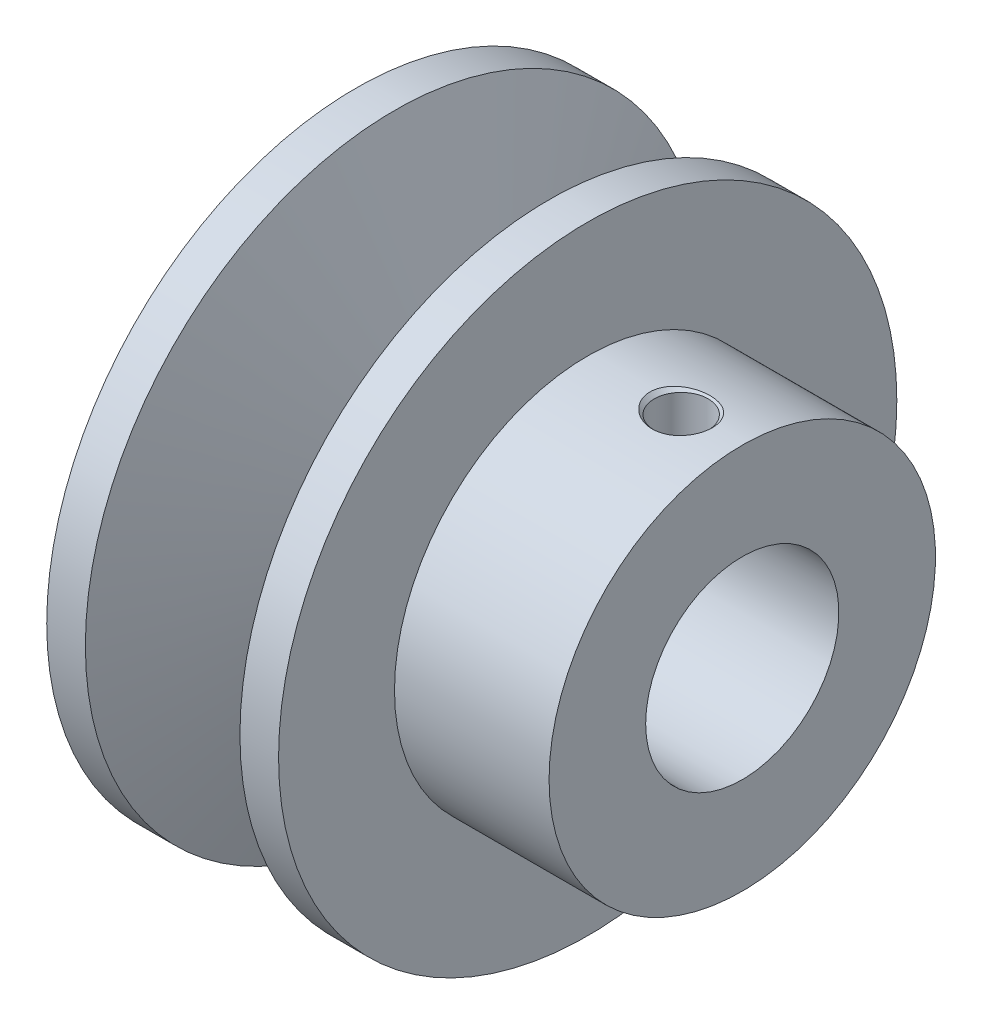
ISO-10303-21;
HEADER;
FILE_DESCRIPTION(('STEP AP214'),'2;1');
FILE_NAME('part.step','',(''),(''),'','','');
FILE_SCHEMA(('AUTOMOTIVE_DESIGN { 1 0 10303 214 1 1 1 1 }'));
ENDSEC;
DATA;
#1=APPLICATION_CONTEXT('core data for automotive mechanical design processes');
#2=APPLICATION_PROTOCOL_DEFINITION('international standard','automotive_design',2000,#1);
#3=PRODUCT_CONTEXT('',#1,'mechanical');
#4=PRODUCT('Part','Part','',(#3));
#5=PRODUCT_RELATED_PRODUCT_CATEGORY('part','',(#4));
#6=PRODUCT_DEFINITION_FORMATION('','',#4);
#7=PRODUCT_DEFINITION_CONTEXT('part definition',#1,'design');
#8=PRODUCT_DEFINITION('design','',#6,#7);
#9=PRODUCT_DEFINITION_SHAPE('','',#8);
#10=(LENGTH_UNIT() NAMED_UNIT(*) SI_UNIT(.MILLI.,.METRE.));
#11=(NAMED_UNIT(*) PLANE_ANGLE_UNIT() SI_UNIT($,.RADIAN.));
#12=(NAMED_UNIT(*) SI_UNIT($,.STERADIAN.) SOLID_ANGLE_UNIT());
#13=UNCERTAINTY_MEASURE_WITH_UNIT(LENGTH_MEASURE(1.E-05),#10,'distance_accuracy_value','');
#14=(GEOMETRIC_REPRESENTATION_CONTEXT(3) GLOBAL_UNCERTAINTY_ASSIGNED_CONTEXT((#13)) GLOBAL_UNIT_ASSIGNED_CONTEXT((#10,
#11,#12)) REPRESENTATION_CONTEXT('',''));
#15=CARTESIAN_POINT('',(0.,0.,0.));
#16=DIRECTION('',(0.,0.,1.));
#17=DIRECTION('',(1.,0.,0.));
#18=AXIS2_PLACEMENT_3D('',#15,#16,#17);
#19=CARTESIAN_POINT('',(0.,0.,0.));
#20=DIRECTION('',(-1.,0.,0.));
#21=DIRECTION('',(0.,0.,1.));
#22=AXIS2_PLACEMENT_3D('',#19,#20,#21);
#23=PLANE('',#22);
#24=CARTESIAN_POINT('',(0.,0.,0.));
#25=DIRECTION('',(-1.,0.,0.));
#26=DIRECTION('',(0.,0.,1.));
#27=AXIS2_PLACEMENT_3D('',#24,#25,#26);
#28=CIRCLE('',#27,40.);
#29=CARTESIAN_POINT('',(0.,0.,40.));
#30=VERTEX_POINT('',#29);
#31=EDGE_CURVE('E118',#30,#30,#28,.T.);
#32=ORIENTED_EDGE('',*,*,#31,.T.);
#33=EDGE_LOOP('',(#32));
#34=FACE_BOUND('',#33,.T.);
#35=CARTESIAN_POINT('',(0.,0.,0.));
#36=DIRECTION('',(-1.,0.,0.));
#37=DIRECTION('',(0.,0.,1.));
#38=AXIS2_PLACEMENT_3D('',#35,#36,#37);
#39=CIRCLE('',#38,20.);
#40=CARTESIAN_POINT('',(0.,0.,20.));
#41=VERTEX_POINT('',#40);
#42=EDGE_CURVE('E51',#41,#41,#39,.T.);
#43=ORIENTED_EDGE('',*,*,#42,.F.);
#44=EDGE_LOOP('',(#43));
#45=FACE_BOUND('',#44,.T.);
#46=ADVANCED_FACE('F39',(#34,#45),#23,.T.);
#47=CARTESIAN_POINT('',(5.,0.,0.));
#48=DIRECTION('',(-1.,0.,0.));
#49=DIRECTION('',(0.,0.,1.));
#50=AXIS2_PLACEMENT_3D('',#47,#48,#49);
#51=CONICAL_SURFACE('',#50,12.5,0.982793723247329);
#52=ORIENTED_EDGE('',*,*,#42,.T.);
#53=EDGE_LOOP('',(#52));
#54=FACE_BOUND('',#53,.T.);
#55=CARTESIAN_POINT('',(5.,0.,0.));
#56=DIRECTION('',(-1.,0.,0.));
#57=DIRECTION('',(0.,0.,1.));
#58=AXIS2_PLACEMENT_3D('',#55,#56,#57);
#59=CIRCLE('',#58,12.5);
#60=CARTESIAN_POINT('',(5.,0.,12.5));
#61=VERTEX_POINT('',#60);
#62=EDGE_CURVE('E54',#61,#61,#59,.T.);
#63=ORIENTED_EDGE('',*,*,#62,.F.);
#64=EDGE_LOOP('',(#63));
#65=FACE_BOUND('',#64,.T.);
#66=ADVANCED_FACE('F106',(#54,#65),#51,.F.);
#67=CARTESIAN_POINT('',(0.,0.,0.));
#68=DIRECTION('',(-1.,0.,0.));
#69=DIRECTION('',(0.,0.,1.));
#70=AXIS2_PLACEMENT_3D('',#67,#68,#69);
#71=CYLINDRICAL_SURFACE('',#70,12.5);
#72=CARTESIAN_POINT('',(42.0953049806795,12.,3.49999999999986));
#73=CARTESIAN_POINT('',(42.2877198053964,12.0000029182384,3.49999615237451));
#74=CARTESIAN_POINT('',(42.4801740218123,12.0046785544293,3.48407876334702));
#75=CARTESIAN_POINT('',(42.8594978347618,12.0228128498504,3.42096698504646));
#76=CARTESIAN_POINT('',(43.0463649620359,12.0362753342026,3.37375897408926));
#77=CARTESIAN_POINT('',(43.4089712475403,12.0703417038929,3.24976086719803));
#78=CARTESIAN_POINT('',(43.5847266870343,12.090934840205,3.17301527806601));
#79=CARTESIAN_POINT('',(43.9209015205686,12.1369281684911,2.99226282033324));
#80=CARTESIAN_POINT('',(44.0813192809724,12.1623288716688,2.88825305219327));
#81=CARTESIAN_POINT('',(44.3866874404064,12.2158603074866,2.65285688670764));
#82=CARTESIAN_POINT('',(44.5311523905499,12.2440433222756,2.52085249343839));
#83=CARTESIAN_POINT('',(44.7962102340267,12.2995144458837,2.23454150476446));
#84=CARTESIAN_POINT('',(44.9168004331992,12.3268024534157,2.08023239576599));
#85=CARTESIAN_POINT('',(45.1327422279712,12.3779964293708,1.75029227363621));
#86=CARTESIAN_POINT('',(45.2276064216959,12.4018335593886,1.57433065035361));
#87=CARTESIAN_POINT('',(45.3862164943987,12.4428371907732,1.20817457795212));
#88=CARTESIAN_POINT('',(45.4499681815116,12.4600049370697,1.01798279299525));
#89=CARTESIAN_POINT('',(45.5429587727763,12.4853656892475,0.633837060621582));
#90=CARTESIAN_POINT('',(45.5730245817056,12.4937733520519,0.440097705604466));
#91=CARTESIAN_POINT('',(45.6003966119025,12.5014192399288,0.0501545766812189));
#92=CARTESIAN_POINT('',(45.5977088560936,12.5006591508232,-0.146048737508597));
#93=CARTESIAN_POINT('',(45.5602218418133,12.4902103188576,-0.529577185864506));
#94=CARTESIAN_POINT('',(45.5263167479014,12.4807702097015,-0.71699753814516));
#95=CARTESIAN_POINT('',(45.4288082484994,12.4543187948504,-1.08337362960891));
#96=CARTESIAN_POINT('',(45.3652030682884,12.4373070367162,-1.26232886225715));
#97=CARTESIAN_POINT('',(45.2094459914205,12.3972647344828,-1.60891633543925));
#98=CARTESIAN_POINT('',(45.116997565171,12.3741720778,-1.77640784364442));
#99=CARTESIAN_POINT('',(44.906408380783,12.3244414260412,-2.09379770763238));
#100=CARTESIAN_POINT('',(44.7882621794386,12.2978026803105,-2.24369232573512));
#101=CARTESIAN_POINT('',(44.5249257414259,12.2427920342732,-2.5269717598349));
#102=CARTESIAN_POINT('',(44.3789573405153,12.2143919832094,-2.65962862514612));
#103=CARTESIAN_POINT('',(44.0665571699179,12.1598610870605,-2.89876928059107));
#104=CARTESIAN_POINT('',(43.9001238747507,12.1337304113856,-3.00525111782691));
#105=CARTESIAN_POINT('',(43.5498105307102,12.0865750163485,-3.18965050384769));
#106=CARTESIAN_POINT('',(43.3658104712445,12.0655895187615,-3.26735080873382));
#107=CARTESIAN_POINT('',(42.9866207261445,12.0315777632379,-3.39046632280543));
#108=CARTESIAN_POINT('',(42.7914341629893,12.0185492959839,-3.43589049422677));
#109=CARTESIAN_POINT('',(42.4022672240517,12.0024030241428,-3.49186889507224));
#110=CARTESIAN_POINT('',(42.2084569351402,11.9989744317496,-3.50351705492399));
#111=CARTESIAN_POINT('',(41.8216538489836,12.0015622285672,-3.49464270434583));
#112=CARTESIAN_POINT('',(41.6286609571839,12.0075774936582,-3.47412402279482));
#113=CARTESIAN_POINT('',(41.2533181274093,12.0280731128579,-3.40246685788961));
#114=CARTESIAN_POINT('',(41.0708280182838,12.04236656542,-3.35200384613678));
#115=CARTESIAN_POINT('',(40.7169070485366,12.0776211582941,-3.22265905357556));
#116=CARTESIAN_POINT('',(40.5454777424725,12.0985832334134,-3.14377328826126));
#117=CARTESIAN_POINT('',(40.2140171513165,12.1454373448375,-2.95765848560508));
#118=CARTESIAN_POINT('',(40.0543563706678,12.1714352674676,-2.84979689170079));
#119=CARTESIAN_POINT('',(39.7549997366154,12.2251912476975,-2.60956338877981));
#120=CARTESIAN_POINT('',(39.6153080451295,12.252949670482,-2.47718638346852));
#121=CARTESIAN_POINT('',(39.3552202530565,12.3081829234521,-2.18658730527825));
#122=CARTESIAN_POINT('',(39.2355920315174,12.335619714701,-2.02766922094423));
#123=CARTESIAN_POINT('',(39.0247000545139,12.3862060696637,-1.6913803752073));
#124=CARTESIAN_POINT('',(38.93343480047,12.4093558598584,-1.51401058937555));
#125=CARTESIAN_POINT('',(38.7827229221558,12.4486113106072,-1.14709270155216));
#126=CARTESIAN_POINT('',(38.7230356533498,12.4647700697764,-0.957649404950056));
#127=CARTESIAN_POINT('',(38.6365019997775,12.4884571543435,-0.570896024719972));
#128=CARTESIAN_POINT('',(38.6096475289984,12.4959876046799,-0.373587890398067));
#129=CARTESIAN_POINT('',(38.5900909894795,12.5014579192325,0.0161518687343968));
#130=CARTESIAN_POINT('',(38.5962678072704,12.4997126237562,0.208523574951511));
#131=CARTESIAN_POINT('',(38.639965628371,12.4875511892793,0.58937813506102));
#132=CARTESIAN_POINT('',(38.6774852330874,12.4771354371761,0.777861162091423));
#133=CARTESIAN_POINT('',(38.7821447480403,12.4488768980248,1.14409378229163));
#134=CARTESIAN_POINT('',(38.8490367234837,12.4310963476457,1.32191935297344));
#135=CARTESIAN_POINT('',(39.0103216686803,12.3899581514136,1.66392283506992));
#136=CARTESIAN_POINT('',(39.1047187816056,12.3665996654369,1.82809868559859));
#137=CARTESIAN_POINT('',(39.3214999777242,12.3159487927087,2.14327684605579));
#138=CARTESIAN_POINT('',(39.4446122357521,12.2885624327911,2.29376313547123));
#139=CARTESIAN_POINT('',(39.7139752781246,12.2332900651242,2.57231846002981));
#140=CARTESIAN_POINT('',(39.8602323554171,12.205403923321,2.7003813783769));
#141=CARTESIAN_POINT('',(40.1761168511118,12.1514815437646,2.93363501349719));
#142=CARTESIAN_POINT('',(40.3462360260642,12.1255087622321,3.03817587370681));
#143=CARTESIAN_POINT('',(40.7023416325963,12.0792917300542,3.21703260079236));
#144=CARTESIAN_POINT('',(40.8883186358859,12.059044105996,3.29136627786814));
#145=CARTESIAN_POINT('',(41.2436097301239,12.0290742856874,3.39912168142623));
#146=CARTESIAN_POINT('',(41.4115353788088,12.0182651534564,3.43685652188085));
#147=CARTESIAN_POINT('',(41.7513989091479,12.0037272136938,3.48729560764374));
#148=CARTESIAN_POINT('',(41.9233362124471,11.9999973918545,3.5000034387754));
#149=CARTESIAN_POINT('',(42.0953049806795,12.,3.49999999999986));
#150=B_SPLINE_CURVE_WITH_KNOTS('',3,(#72,#73,#74,#75,#76,#77,#78,#79,#80,#81,#82,#83,#84,#85,
#86,#87,#88,#89,#90,#91,#92,#93,#94,#95,#96,#97,#98,#99,#100,#101,#102,#103,#104,#105,#106,#107,
#108,#109,#110,#111,#112,#113,#114,#115,#116,#117,#118,#119,#120,#121,#122,#123,#124,#125,#126,
#127,#128,#129,#130,#131,#132,#133,#134,#135,#136,#137,#138,#139,#140,#141,#142,#143,#144,#145,
#146,#147,#148,#149),.UNSPECIFIED.,.T.,.F.,(4,2,2,2,2,2,2,2,2,2,2,2,2,2,2,2,2,2,2,2,2,2,2,2,2,2,
2,2,2,2,2,2,2,2,2,2,2,2,4),(0.,0.576611367799125,1.15347391568279,1.72947063688369,
2.30552864007482,2.89595138133577,3.48644071128029,4.08743969019362,4.68832643065513,
5.27411559708616,5.85979704669184,6.4292076701932,6.99865232303127,7.5741557255573,
8.14978114796733,8.74483404784928,9.33993133068579,9.93943306827212,10.5387682748256,
11.1184628491913,11.6980884266741,12.2651111154848,12.8322133245598,13.4128741853846,
13.9936558904935,14.5931741279637,15.1926606840337,15.7875104510376,16.3822136897969,
16.9568630014037,17.5314866720957,18.1013504374818,18.6713000873781,19.2576755819283,
19.8442107835224,20.4453695275071,21.046173311345,21.5615876367407,22.0769281091554),.UNSPECIFIED.);
#151=CARTESIAN_POINT('',(42.0953049806795,12.,3.49999999999986));
#152=VERTEX_POINT('',#151);
#153=EDGE_CURVE('E45',#152,#152,#150,.T.);
#154=ORIENTED_EDGE('',*,*,#153,.T.);
#155=EDGE_LOOP('',(#154));
#156=FACE_BOUND('',#155,.T.);
#157=CARTESIAN_POINT('',(50.,0.,0.));
#158=DIRECTION('',(-1.,0.,0.));
#159=DIRECTION('',(0.,0.,1.));
#160=AXIS2_PLACEMENT_3D('',#157,#158,#159);
#161=CIRCLE('',#160,12.5);
#162=CARTESIAN_POINT('',(50.,0.,12.5));
#163=VERTEX_POINT('',#162);
#164=EDGE_CURVE('E125',#163,#163,#161,.T.);
#165=ORIENTED_EDGE('',*,*,#164,.F.);
#166=EDGE_LOOP('',(#165));
#167=FACE_BOUND('',#166,.T.);
#168=ORIENTED_EDGE('',*,*,#62,.T.);
#169=EDGE_LOOP('',(#168));
#170=FACE_BOUND('',#169,.T.);
#171=ADVANCED_FACE('F112',(#156,#167,#170),#71,.F.);
#172=CARTESIAN_POINT('',(50.,0.,0.));
#173=DIRECTION('',(-1.,0.,0.));
#174=DIRECTION('',(0.,0.,1.));
#175=AXIS2_PLACEMENT_3D('',#172,#173,#174);
#176=PLANE('',#175);
#177=CARTESIAN_POINT('',(50.,0.,0.));
#178=DIRECTION('',(-1.,0.,0.));
#179=DIRECTION('',(0.,0.,1.));
#180=AXIS2_PLACEMENT_3D('',#177,#178,#179);
#181=CIRCLE('',#180,25.);
#182=CARTESIAN_POINT('',(50.,0.,25.));
#183=VERTEX_POINT('',#182);
#184=EDGE_CURVE('E121',#183,#183,#181,.T.);
#185=ORIENTED_EDGE('',*,*,#184,.F.);
#186=EDGE_LOOP('',(#185));
#187=FACE_BOUND('',#186,.T.);
#188=ORIENTED_EDGE('',*,*,#164,.T.);
#189=EDGE_LOOP('',(#188));
#190=FACE_BOUND('',#189,.T.);
#191=ADVANCED_FACE('F101',(#187,#190),#176,.F.);
#192=CARTESIAN_POINT('',(0.,0.,0.));
#193=DIRECTION('',(-1.,0.,0.));
#194=DIRECTION('',(0.,0.,1.));
#195=AXIS2_PLACEMENT_3D('',#192,#193,#194);
#196=CYLINDRICAL_SURFACE('',#195,25.);
#197=CARTESIAN_POINT('',(39.3388749347931,24.8510405488022,-2.72502912292255));
#198=CARTESIAN_POINT('',(39.1947437964581,24.8648694537165,-2.59890878351794));
#199=CARTESIAN_POINT('',(39.0598347945445,24.8788828021447,-2.46225876568921));
#200=CARTESIAN_POINT('',(38.8119625183708,24.906064640308,-2.17012810773962));
#201=CARTESIAN_POINT('',(38.6990063583503,24.9192328552385,-2.01464138963648));
#202=CARTESIAN_POINT('',(38.4861654434584,24.9449931089477,-1.66766142687128));
#203=CARTESIAN_POINT('',(38.3895976993282,24.9573150267982,-1.47409175525755));
#204=CARTESIAN_POINT('',(38.232862734936,24.9777923395279,-1.07248484754528));
#205=CARTESIAN_POINT('',(38.1726902944377,24.9859483319063,-0.864449691029086));
#206=CARTESIAN_POINT('',(38.0944769916039,24.9966341722983,-0.455267654947966));
#207=CARTESIAN_POINT('',(38.0738305077609,24.9995114010291,-0.254626327452572));
#208=CARTESIAN_POINT('',(38.0676121462325,25.000373132344,0.147170878813862));
#209=CARTESIAN_POINT('',(38.0820291960299,24.9983591794873,0.348326575116012));
#210=CARTESIAN_POINT('',(38.1440769689478,24.9898452836992,0.737704342598313));
#211=CARTESIAN_POINT('',(38.1904676005086,24.9835129232976,0.926130050192603));
#212=CARTESIAN_POINT('',(38.3132414251494,24.9672286203511,1.29274787669188));
#213=CARTESIAN_POINT('',(38.3896272347885,24.9572763620384,1.47093910126086));
#214=CARTESIAN_POINT('',(38.5718455798877,24.9344936058842,1.81711657439037));
#215=CARTESIAN_POINT('',(38.6783728592816,24.9215967855879,1.9847316031745));
#216=CARTESIAN_POINT('',(38.9163534042796,24.8943847491826,2.30105697819928));
#217=CARTESIAN_POINT('',(39.0478133722965,24.8800691521729,2.44976222310894));
#218=CARTESIAN_POINT('',(39.3413046711416,24.8504170764117,2.73471753905172));
#219=CARTESIAN_POINT('',(39.5047947821154,24.8350765044807,2.86946401827029));
#220=CARTESIAN_POINT('',(39.8509353597593,24.8058860023052,3.1117433374479));
#221=CARTESIAN_POINT('',(40.0335918659168,24.7920365447249,3.2192675628079));
#222=CARTESIAN_POINT('',(40.4265641193753,24.7663054029568,3.41178006766437));
#223=CARTESIAN_POINT('',(40.637920365646,24.7546281750934,3.49467503100745));
#224=CARTESIAN_POINT('',(41.0713285038409,24.7357703219025,3.62575028196062));
#225=CARTESIAN_POINT('',(41.2933828555223,24.7285907360583,3.67392254493768));
#226=CARTESIAN_POINT('',(41.7521906109357,24.7192890722535,3.73601588211088));
#227=CARTESIAN_POINT('',(41.9891636390764,24.717400089943,3.74835920094643));
#228=CARTESIAN_POINT('',(42.4619228610284,24.7195622288109,3.73407066772567));
#229=CARTESIAN_POINT('',(42.6977089010381,24.7236141008461,3.70743388902703));
#230=CARTESIAN_POINT('',(43.1644072571417,24.737283064781,3.61511018186581));
#231=CARTESIAN_POINT('',(43.3952232865457,24.7469683373384,3.5489445677029));
#232=CARTESIAN_POINT('',(43.8421118076505,24.7708178271256,3.3784541790161));
#233=CARTESIAN_POINT('',(44.0581838853785,24.7849821700534,3.2741283335723));
#234=CARTESIAN_POINT('',(44.4653621210813,24.815819789819,3.03146050823784));
#235=CARTESIAN_POINT('',(44.6568180991224,24.8324483606611,2.89370130225038));
#236=CARTESIAN_POINT('',(45.0121941033945,24.8663365671842,2.58633307372736));
#237=CARTESIAN_POINT('',(45.1761215249802,24.8835960318577,2.41673263113196));
#238=CARTESIAN_POINT('',(45.4622359470931,24.9156311819385,2.05954555718347));
#239=CARTESIAN_POINT('',(45.5861502049298,24.9304893546981,1.87335282911859));
#240=CARTESIAN_POINT('',(45.7980361725541,24.9568461769423,1.48130866893327));
#241=CARTESIAN_POINT('',(45.8860292972401,24.968346826894,1.27546904017611));
#242=CARTESIAN_POINT('',(46.0165963042827,24.9857310709894,0.867044732083355));
#243=CARTESIAN_POINT('',(46.0621378797945,24.9919780403724,0.665422831222874));
#244=CARTESIAN_POINT('',(46.1168518091061,24.9995083139794,0.257232113938802));
#245=CARTESIAN_POINT('',(46.1260383333262,25.0007935521753,0.0506652565448771));
#246=CARTESIAN_POINT('',(46.108141069363,24.9983150038393,-0.349435595093549));
#247=CARTESIAN_POINT('',(46.0830203857678,24.9948244727884,-0.54306262130277));
#248=CARTESIAN_POINT('',(46.0010307492667,24.9836681062702,-0.923320524407542));
#249=CARTESIAN_POINT('',(45.9441623048949,24.9760023376818,-1.10995151331419));
#250=CARTESIAN_POINT('',(45.8006086041687,24.9572788429522,-1.47218553999287));
#251=CARTESIAN_POINT('',(45.7137797384204,24.9462048080967,-1.64773055494787));
#252=CARTESIAN_POINT('',(45.5135152057304,24.9218193116637,-1.98271988861429));
#253=CARTESIAN_POINT('',(45.4000736952815,24.9085073588745,-2.14216066019968));
#254=CARTESIAN_POINT('',(45.1430158448994,24.8801413336931,-2.45028303377477));
#255=CARTESIAN_POINT('',(44.9980449729102,24.8650311705404,-2.59782806198683));
#256=CARTESIAN_POINT('',(44.6868145713286,24.8352671611973,-2.86846371324916));
#257=CARTESIAN_POINT('',(44.520548222098,24.8206134630617,-2.99154647016989));
#258=CARTESIAN_POINT('',(44.1583987787398,24.792156775572,-3.21917819185477));
#259=CARTESIAN_POINT('',(43.9612393476851,24.7784941727289,-3.32171589885345));
#260=CARTESIAN_POINT('',(43.553004430377,24.7547383685534,-3.49435878103698));
#261=CARTESIAN_POINT('',(43.3419254880762,24.7446460576706,-3.56445586670289));
#262=CARTESIAN_POINT('',(42.8996563956547,24.7286443271578,-3.67388315374431));
#263=CARTESIAN_POINT('',(42.6679953126899,24.7229893501639,-3.71135381256682));
#264=CARTESIAN_POINT('',(42.2015571473172,24.7174257436617,-3.74822763489228));
#265=CARTESIAN_POINT('',(41.9667792669898,24.7175186151507,-3.74762085482557));
#266=CARTESIAN_POINT('',(41.4952673988833,24.723509625218,-3.70789569357796));
#267=CARTESIAN_POINT('',(41.2586071524155,24.7295375897082,-3.66791605472642));
#268=CARTESIAN_POINT('',(40.7955511147734,24.7468937421278,-3.54892139541693));
#269=CARTESIAN_POINT('',(40.5691511938587,24.7582197764452,-3.46992223527367));
#270=CARTESIAN_POINT('',(40.1677085296904,24.7827217059449,-3.28991392719087));
#271=CARTESIAN_POINT('',(39.9901860867358,24.7953272189879,-3.19431433927261));
#272=CARTESIAN_POINT('',(39.6513586753958,24.8222350281272,-2.97800424237351));
#273=CARTESIAN_POINT('',(39.4900443985043,24.8365363399009,-2.85730827017082));
#274=CARTESIAN_POINT('',(39.3388749347931,24.8510405488022,-2.72502912292255));
#275=B_SPLINE_CURVE_WITH_KNOTS('',3,(#197,#198,#199,#200,#201,#202,#203,#204,#205,#206,#207,
#208,#209,#210,#211,#212,#213,#214,#215,#216,#217,#218,#219,#220,#221,#222,#223,#224,#225,#226,
#227,#228,#229,#230,#231,#232,#233,#234,#235,#236,#237,#238,#239,#240,#241,#242,#243,#244,#245,
#246,#247,#248,#249,#250,#251,#252,#253,#254,#255,#256,#257,#258,#259,#260,#261,#262,#263,#264,
#265,#266,#267,#268,#269,#270,#271,#272,#273,#274),.UNSPECIFIED.,.T.,.F.,(4,2,2,2,2,2,2,2,2,2,2,
2,2,2,2,2,2,2,2,2,2,2,2,2,2,2,2,2,2,2,2,2,2,2,2,2,2,2,4),(0.,0.57551503294419,1.15121626271097,
1.79773317022266,2.44415732478063,3.04626417563119,3.64818091521391,4.22797689958241,
4.807823472336,5.40230924124021,5.99695504707853,6.63147071368329,7.26618692521302,
7.94514621185531,8.62426235996559,9.33286130940464,10.0415498254514,10.7589994877763,
11.4764692859879,12.1822329643768,12.8878067399164,13.5566902458571,14.225174402903,
14.8423504044318,15.4592858202674,16.042359307457,16.6254234552708,17.2113221495439,
17.7973496139223,18.416887432483,19.0366241494919,19.7016420935646,20.3668257798514,
21.0678205232476,21.7689983256748,22.485862510365,23.2024355498505,23.806403458009,
24.4100224947623),.UNSPECIFIED.);
#276=CARTESIAN_POINT('',(39.3388749347931,24.8510405488022,-2.72502912292255));
#277=VERTEX_POINT('',#276);
#278=EDGE_CURVE('E10',#277,#277,#275,.T.);
#279=ORIENTED_EDGE('',*,*,#278,.F.);
#280=EDGE_LOOP('',(#279));
#281=FACE_BOUND('',#280,.T.);
#282=ORIENTED_EDGE('',*,*,#184,.T.);
#283=EDGE_LOOP('',(#282));
#284=FACE_BOUND('',#283,.T.);
#285=CARTESIAN_POINT('',(30.,0.,0.));
#286=DIRECTION('',(-1.,0.,0.));
#287=DIRECTION('',(0.,0.,1.));
#288=AXIS2_PLACEMENT_3D('',#285,#286,#287);
#289=CIRCLE('',#288,25.);
#290=CARTESIAN_POINT('',(30.,0.,25.));
#291=VERTEX_POINT('',#290);
#292=EDGE_CURVE('E129',#291,#291,#289,.T.);
#293=ORIENTED_EDGE('',*,*,#292,.F.);
#294=EDGE_LOOP('',(#293));
#295=FACE_BOUND('',#294,.T.);
#296=ADVANCED_FACE('F62',(#281,#284,#295),#196,.T.);
#297=CARTESIAN_POINT('',(30.,0.,0.));
#298=DIRECTION('',(1.,0.,0.));
#299=DIRECTION('',(0.,0.,-1.));
#300=AXIS2_PLACEMENT_3D('',#297,#298,#299);
#301=PLANE('',#300);
#302=ORIENTED_EDGE('',*,*,#292,.T.);
#303=EDGE_LOOP('',(#302));
#304=FACE_BOUND('',#303,.T.);
#305=CARTESIAN_POINT('',(30.,0.,0.));
#306=DIRECTION('',(-1.,0.,0.));
#307=DIRECTION('',(0.,0.,1.));
#308=AXIS2_PLACEMENT_3D('',#305,#306,#307);
#309=CIRCLE('',#308,40.);
#310=CARTESIAN_POINT('',(30.,0.,40.));
#311=VERTEX_POINT('',#310);
#312=EDGE_CURVE('E133',#311,#311,#309,.T.);
#313=ORIENTED_EDGE('',*,*,#312,.F.);
#314=EDGE_LOOP('',(#313));
#315=FACE_BOUND('',#314,.T.);
#316=ADVANCED_FACE('F91',(#304,#315),#301,.T.);
#317=CARTESIAN_POINT('',(0.,0.,0.));
#318=DIRECTION('',(-1.,0.,0.));
#319=DIRECTION('',(0.,0.,1.));
#320=AXIS2_PLACEMENT_3D('',#317,#318,#319);
#321=CYLINDRICAL_SURFACE('',#320,40.);
#322=ORIENTED_EDGE('',*,*,#312,.T.);
#323=EDGE_LOOP('',(#322));
#324=FACE_BOUND('',#323,.T.);
#325=CARTESIAN_POINT('',(25.,0.,0.));
#326=DIRECTION('',(-1.,0.,0.));
#327=DIRECTION('',(0.,0.,1.));
#328=AXIS2_PLACEMENT_3D('',#325,#326,#327);
#329=CIRCLE('',#328,40.);
#330=CARTESIAN_POINT('',(25.,0.,40.));
#331=VERTEX_POINT('',#330);
#332=EDGE_CURVE('E135',#331,#331,#329,.T.);
#333=ORIENTED_EDGE('',*,*,#332,.F.);
#334=EDGE_LOOP('',(#333));
#335=FACE_BOUND('',#334,.T.);
#336=ADVANCED_FACE('F89',(#324,#335),#321,.T.);
#337=CARTESIAN_POINT('',(17.7205953146759,0.,0.));
#338=DIRECTION('',(1.,0.,0.));
#339=DIRECTION('',(0.,0.,-1.));
#340=AXIS2_PLACEMENT_3D('',#337,#338,#339);
#341=CONICAL_SURFACE('',#340,20.,1.22173047639603);
#342=ORIENTED_EDGE('',*,*,#332,.T.);
#343=EDGE_LOOP('',(#342));
#344=FACE_BOUND('',#343,.T.);
#345=CARTESIAN_POINT('',(17.7205953146759,0.,0.));
#346=DIRECTION('',(-1.,0.,0.));
#347=DIRECTION('',(0.,0.,1.));
#348=AXIS2_PLACEMENT_3D('',#345,#346,#347);
#349=CIRCLE('',#348,20.);
#350=CARTESIAN_POINT('',(17.7205953146759,0.,20.));
#351=VERTEX_POINT('',#350);
#352=EDGE_CURVE('E140',#351,#351,#349,.T.);
#353=ORIENTED_EDGE('',*,*,#352,.F.);
#354=EDGE_LOOP('',(#353));
#355=FACE_BOUND('',#354,.T.);
#356=ADVANCED_FACE('F88',(#344,#355),#341,.T.);
#357=CARTESIAN_POINT('',(0.,0.,0.));
#358=DIRECTION('',(-1.,0.,0.));
#359=DIRECTION('',(0.,0.,1.));
#360=AXIS2_PLACEMENT_3D('',#357,#358,#359);
#361=CYLINDRICAL_SURFACE('',#360,20.);
#362=CARTESIAN_POINT('',(12.2794046853241,0.,0.));
#363=DIRECTION('',(-1.,0.,0.));
#364=DIRECTION('',(0.,0.,1.));
#365=AXIS2_PLACEMENT_3D('',#362,#363,#364);
#366=CIRCLE('',#365,20.);
#367=CARTESIAN_POINT('',(12.2794046853241,0.,20.));
#368=VERTEX_POINT('',#367);
#369=EDGE_CURVE('E138',#368,#368,#366,.T.);
#370=ORIENTED_EDGE('',*,*,#369,.F.);
#371=EDGE_LOOP('',(#370));
#372=FACE_BOUND('',#371,.T.);
#373=ORIENTED_EDGE('',*,*,#352,.T.);
#374=EDGE_LOOP('',(#373));
#375=FACE_BOUND('',#374,.T.);
#376=ADVANCED_FACE('F85',(#372,#375),#361,.T.);
#377=CARTESIAN_POINT('',(12.2794046853241,0.,0.));
#378=DIRECTION('',(-1.,0.,0.));
#379=DIRECTION('',(0.,0.,1.));
#380=AXIS2_PLACEMENT_3D('',#377,#378,#379);
#381=CONICAL_SURFACE('',#380,20.,1.22173047639603);
#382=CARTESIAN_POINT('',(5.,0.,0.));
#383=DIRECTION('',(-1.,0.,0.));
#384=DIRECTION('',(0.,0.,1.));
#385=AXIS2_PLACEMENT_3D('',#382,#383,#384);
#386=CIRCLE('',#385,40.);
#387=CARTESIAN_POINT('',(5.,0.,40.));
#388=VERTEX_POINT('',#387);
#389=EDGE_CURVE('E141',#388,#388,#386,.T.);
#390=ORIENTED_EDGE('',*,*,#389,.F.);
#391=EDGE_LOOP('',(#390));
#392=FACE_BOUND('',#391,.T.);
#393=ORIENTED_EDGE('',*,*,#369,.T.);
#394=EDGE_LOOP('',(#393));
#395=FACE_BOUND('',#394,.T.);
#396=ADVANCED_FACE('F77',(#392,#395),#381,.T.);
#397=CARTESIAN_POINT('',(0.,0.,0.));
#398=DIRECTION('',(-1.,0.,0.));
#399=DIRECTION('',(0.,0.,1.));
#400=AXIS2_PLACEMENT_3D('',#397,#398,#399);
#401=CYLINDRICAL_SURFACE('',#400,40.);
#402=ORIENTED_EDGE('',*,*,#31,.F.);
#403=EDGE_LOOP('',(#402));
#404=FACE_BOUND('',#403,.T.);
#405=ORIENTED_EDGE('',*,*,#389,.T.);
#406=EDGE_LOOP('',(#405));
#407=FACE_BOUND('',#406,.T.);
#408=ADVANCED_FACE('F74',(#404,#407),#401,.T.);
#409=CARTESIAN_POINT('',(42.0953049806795,25.,-2.63391908912169E-13));
#410=DIRECTION('',(0.,1.,0.));
#411=DIRECTION('',(0.,0.,1.));
#412=AXIS2_PLACEMENT_3D('',#409,#410,#411);
#413=CYLINDRICAL_SURFACE('',#412,3.49999999999999);
#414=CARTESIAN_POINT('',(42.0953049806795,24.475,-2.57828531846536E-13));
#415=DIRECTION('',(0.,1.,0.));
#416=DIRECTION('',(0.,0.,1.));
#417=AXIS2_PLACEMENT_3D('',#414,#415,#416);
#418=CIRCLE('',#417,3.49999999999999);
#419=CARTESIAN_POINT('',(42.0953049806795,24.475,3.49999999999973));
#420=VERTEX_POINT('',#419);
#421=EDGE_CURVE('E150',#420,#420,#418,.T.);
#422=ORIENTED_EDGE('',*,*,#421,.T.);
#423=EDGE_LOOP('',(#422));
#424=FACE_BOUND('',#423,.T.);
#425=ORIENTED_EDGE('',*,*,#153,.F.);
#426=EDGE_LOOP('',(#425));
#427=FACE_BOUND('',#426,.T.);
#428=ADVANCED_FACE('F68',(#424,#427),#413,.F.);
#429=CARTESIAN_POINT('',(42.0953049806795,25.,-2.63391908912169E-13));
#430=DIRECTION('',(0.,1.,0.));
#431=DIRECTION('',(0.,0.,1.));
#432=AXIS2_PLACEMENT_3D('',#429,#430,#431);
#433=CONICAL_SURFACE('',#432,4.025,0.785398163397432);
#434=ORIENTED_EDGE('',*,*,#278,.T.);
#435=EDGE_LOOP('',(#434));
#436=FACE_BOUND('',#435,.T.);
#437=ORIENTED_EDGE('',*,*,#421,.F.);
#438=EDGE_LOOP('',(#437));
#439=FACE_BOUND('',#438,.T.);
#440=ADVANCED_FACE('F70',(#436,#439),#433,.F.);
#441=CLOSED_SHELL('',(#46,#66,#171,#191,#296,#316,#336,#356,#376,#396,#408,#428,#440));
#442=MANIFOLD_SOLID_BREP('B2',#441);
#443=ADVANCED_BREP_SHAPE_REPRESENTATION('',(#18,#442),#14);
#444=SHAPE_DEFINITION_REPRESENTATION(#9,#443);
ENDSEC;
END-ISO-10303-21;
